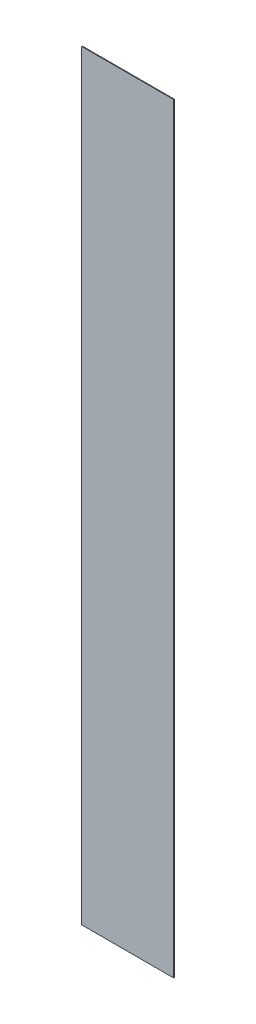
ISO-10303-21;
HEADER;
FILE_DESCRIPTION(('STEP AP214'),'2;1');
FILE_NAME('part.step','',(''),(''),'','','');
FILE_SCHEMA(('AUTOMOTIVE_DESIGN { 1 0 10303 214 1 1 1 1 }'));
ENDSEC;
DATA;
#1=APPLICATION_CONTEXT('core data for automotive mechanical design processes');
#2=APPLICATION_PROTOCOL_DEFINITION('international standard','automotive_design',2000,#1);
#3=PRODUCT_CONTEXT('',#1,'mechanical');
#4=PRODUCT('Part','Part','',(#3));
#5=PRODUCT_RELATED_PRODUCT_CATEGORY('part','',(#4));
#6=PRODUCT_DEFINITION_FORMATION('','',#4);
#7=PRODUCT_DEFINITION_CONTEXT('part definition',#1,'design');
#8=PRODUCT_DEFINITION('design','',#6,#7);
#9=PRODUCT_DEFINITION_SHAPE('','',#8);
#10=(LENGTH_UNIT() NAMED_UNIT(*) SI_UNIT(.MILLI.,.METRE.));
#11=(NAMED_UNIT(*) PLANE_ANGLE_UNIT() SI_UNIT($,.RADIAN.));
#12=(NAMED_UNIT(*) SI_UNIT($,.STERADIAN.) SOLID_ANGLE_UNIT());
#13=UNCERTAINTY_MEASURE_WITH_UNIT(LENGTH_MEASURE(1.E-05),#10,'distance_accuracy_value','');
#14=(GEOMETRIC_REPRESENTATION_CONTEXT(3) GLOBAL_UNCERTAINTY_ASSIGNED_CONTEXT((#13)) GLOBAL_UNIT_ASSIGNED_CONTEXT((#10,
#11,#12)) REPRESENTATION_CONTEXT('',''));
#15=CARTESIAN_POINT('',(0.,0.,0.));
#16=DIRECTION('',(0.,0.,1.));
#17=DIRECTION('',(1.,0.,0.));
#18=AXIS2_PLACEMENT_3D('',#15,#16,#17);
#19=CARTESIAN_POINT('',(-5.43948406849353,5.2252123716023,0.));
#20=DIRECTION('',(-1.,0.,0.));
#21=DIRECTION('',(0.,0.,1.));
#22=AXIS2_PLACEMENT_3D('',#19,#20,#21);
#23=PLANE('',#22);
#24=DIRECTION('',(0.,1.,0.));
#25=VECTOR('',#24,1.);
#26=CARTESIAN_POINT('',(-5.43948406849353,4.63764145522955,0.));
#27=LINE('',#26,#25);
#28=CARTESIAN_POINT('',(-5.43948406849353,4.63764145522955,0.));
#29=VERTEX_POINT('',#28);
#30=CARTESIAN_POINT('',(-5.43948406849353,5.81278328797505,0.));
#31=VERTEX_POINT('',#30);
#32=EDGE_CURVE('E11',#29,#31,#27,.T.);
#33=ORIENTED_EDGE('',*,*,#32,.F.);
#34=DIRECTION('',(0.,0.,1.));
#35=VECTOR('',#34,1.);
#36=CARTESIAN_POINT('',(-5.43948406849353,4.63764145522955,0.));
#37=LINE('',#36,#35);
#38=CARTESIAN_POINT('',(-5.43948406849353,4.63764145522955,0.001));
#39=VERTEX_POINT('',#38);
#40=EDGE_CURVE('E24',#29,#39,#37,.T.);
#41=ORIENTED_EDGE('',*,*,#40,.T.);
#42=DIRECTION('',(0.,-1.,0.));
#43=VECTOR('',#42,1.);
#44=CARTESIAN_POINT('',(-5.43948406849353,5.81278328797505,0.001));
#45=LINE('',#44,#43);
#46=CARTESIAN_POINT('',(-5.43948406849353,5.81278328797505,0.001));
#47=VERTEX_POINT('',#46);
#48=EDGE_CURVE('E75',#47,#39,#45,.T.);
#49=ORIENTED_EDGE('',*,*,#48,.F.);
#50=DIRECTION('',(0.,0.,1.));
#51=VECTOR('',#50,1.);
#52=CARTESIAN_POINT('',(-5.43948406849353,5.81278328797505,0.));
#53=LINE('',#52,#51);
#54=EDGE_CURVE('E85',#31,#47,#53,.T.);
#55=ORIENTED_EDGE('',*,*,#54,.F.);
#56=EDGE_LOOP('',(#33,#41,#49,#55));
#57=FACE_BOUND('',#56,.T.);
#58=ADVANCED_FACE('F17',(#57),#23,.T.);
#59=CARTESIAN_POINT('',(-5.36837385673728,5.81278328797505,0.));
#60=DIRECTION('',(0.,1.,0.));
#61=DIRECTION('',(0.,0.,1.));
#62=AXIS2_PLACEMENT_3D('',#59,#60,#61);
#63=PLANE('',#62);
#64=DIRECTION('',(1.,0.,0.));
#65=VECTOR('',#64,1.);
#66=CARTESIAN_POINT('',(-5.43948406849353,5.81278328797505,0.));
#67=LINE('',#66,#65);
#68=CARTESIAN_POINT('',(-5.29726364498103,5.81278328797505,0.));
#69=VERTEX_POINT('',#68);
#70=EDGE_CURVE('E83',#31,#69,#67,.T.);
#71=ORIENTED_EDGE('',*,*,#70,.F.);
#72=ORIENTED_EDGE('',*,*,#54,.T.);
#73=DIRECTION('',(-1.,0.,0.));
#74=VECTOR('',#73,1.);
#75=CARTESIAN_POINT('',(-5.29726364498103,5.81278328797505,0.001));
#76=LINE('',#75,#74);
#77=CARTESIAN_POINT('',(-5.29726364498103,5.81278328797505,0.001));
#78=VERTEX_POINT('',#77);
#79=EDGE_CURVE('E81',#78,#47,#76,.T.);
#80=ORIENTED_EDGE('',*,*,#79,.F.);
#81=DIRECTION('',(0.,0.,1.));
#82=VECTOR('',#81,1.);
#83=CARTESIAN_POINT('',(-5.29726364498103,5.81278328797505,0.));
#84=LINE('',#83,#82);
#85=EDGE_CURVE('E61',#69,#78,#84,.T.);
#86=ORIENTED_EDGE('',*,*,#85,.F.);
#87=EDGE_LOOP('',(#71,#72,#80,#86));
#88=FACE_BOUND('',#87,.T.);
#89=ADVANCED_FACE('F91',(#88),#63,.T.);
#90=CARTESIAN_POINT('',(-5.29726364498103,5.2252123716023,0.));
#91=DIRECTION('',(1.,0.,0.));
#92=DIRECTION('',(0.,0.,-1.));
#93=AXIS2_PLACEMENT_3D('',#90,#91,#92);
#94=PLANE('',#93);
#95=DIRECTION('',(0.,-1.,0.));
#96=VECTOR('',#95,1.);
#97=CARTESIAN_POINT('',(-5.29726364498103,5.81278328797505,0.));
#98=LINE('',#97,#96);
#99=CARTESIAN_POINT('',(-5.29726364498103,4.63764145522955,0.));
#100=VERTEX_POINT('',#99);
#101=EDGE_CURVE('E65',#69,#100,#98,.T.);
#102=ORIENTED_EDGE('',*,*,#101,.F.);
#103=ORIENTED_EDGE('',*,*,#85,.T.);
#104=DIRECTION('',(0.,1.,0.));
#105=VECTOR('',#104,1.);
#106=CARTESIAN_POINT('',(-5.29726364498103,4.63764145522955,0.001));
#107=LINE('',#106,#105);
#108=CARTESIAN_POINT('',(-5.29726364498103,4.63764145522955,0.001));
#109=VERTEX_POINT('',#108);
#110=EDGE_CURVE('E54',#109,#78,#107,.T.);
#111=ORIENTED_EDGE('',*,*,#110,.F.);
#112=DIRECTION('',(0.,0.,1.));
#113=VECTOR('',#112,1.);
#114=CARTESIAN_POINT('',(-5.29726364498103,4.63764145522955,0.));
#115=LINE('',#114,#113);
#116=EDGE_CURVE('E58',#100,#109,#115,.T.);
#117=ORIENTED_EDGE('',*,*,#116,.F.);
#118=EDGE_LOOP('',(#102,#103,#111,#117));
#119=FACE_BOUND('',#118,.T.);
#120=ADVANCED_FACE('F57',(#119),#94,.T.);
#121=CARTESIAN_POINT('',(-5.36837385673728,4.63764145522955,0.));
#122=DIRECTION('',(0.,-1.,0.));
#123=DIRECTION('',(0.,0.,-1.));
#124=AXIS2_PLACEMENT_3D('',#121,#122,#123);
#125=PLANE('',#124);
#126=DIRECTION('',(-1.,0.,0.));
#127=VECTOR('',#126,1.);
#128=CARTESIAN_POINT('',(-5.29726364498103,4.63764145522955,0.));
#129=LINE('',#128,#127);
#130=EDGE_CURVE('E71',#100,#29,#129,.T.);
#131=ORIENTED_EDGE('',*,*,#130,.F.);
#132=ORIENTED_EDGE('',*,*,#116,.T.);
#133=DIRECTION('',(1.,0.,0.));
#134=VECTOR('',#133,1.);
#135=CARTESIAN_POINT('',(-5.43948406849353,4.63764145522955,0.001));
#136=LINE('',#135,#134);
#137=EDGE_CURVE('E70',#39,#109,#136,.T.);
#138=ORIENTED_EDGE('',*,*,#137,.F.);
#139=ORIENTED_EDGE('',*,*,#40,.F.);
#140=EDGE_LOOP('',(#131,#132,#138,#139));
#141=FACE_BOUND('',#140,.T.);
#142=ADVANCED_FACE('F69',(#141),#125,.T.);
#143=CARTESIAN_POINT('',(-5.36837385673728,4.63764145522955,0.));
#144=DIRECTION('',(0.,0.,1.));
#145=DIRECTION('',(1.,0.,0.));
#146=AXIS2_PLACEMENT_3D('',#143,#144,#145);
#147=PLANE('',#146);
#148=ORIENTED_EDGE('',*,*,#130,.T.);
#149=ORIENTED_EDGE('',*,*,#32,.T.);
#150=ORIENTED_EDGE('',*,*,#70,.T.);
#151=ORIENTED_EDGE('',*,*,#101,.T.);
#152=EDGE_LOOP('',(#148,#149,#150,#151));
#153=FACE_BOUND('',#152,.T.);
#154=ADVANCED_FACE('F88',(#153),#147,.F.);
#155=CARTESIAN_POINT('',(-5.36837385673728,4.63764145522955,0.001));
#156=DIRECTION('',(0.,0.,1.));
#157=DIRECTION('',(1.,0.,0.));
#158=AXIS2_PLACEMENT_3D('',#155,#156,#157);
#159=PLANE('',#158);
#160=ORIENTED_EDGE('',*,*,#137,.T.);
#161=ORIENTED_EDGE('',*,*,#110,.T.);
#162=ORIENTED_EDGE('',*,*,#79,.T.);
#163=ORIENTED_EDGE('',*,*,#48,.T.);
#164=EDGE_LOOP('',(#160,#161,#162,#163));
#165=FACE_BOUND('',#164,.T.);
#166=ADVANCED_FACE('F74',(#165),#159,.T.);
#167=CLOSED_SHELL('',(#58,#89,#120,#142,#154,#166));
#168=MANIFOLD_SOLID_BREP('B1',#167);
#169=ADVANCED_BREP_SHAPE_REPRESENTATION('',(#18,#168),#14);
#170=SHAPE_DEFINITION_REPRESENTATION(#9,#169);
ENDSEC;
END-ISO-10303-21;
